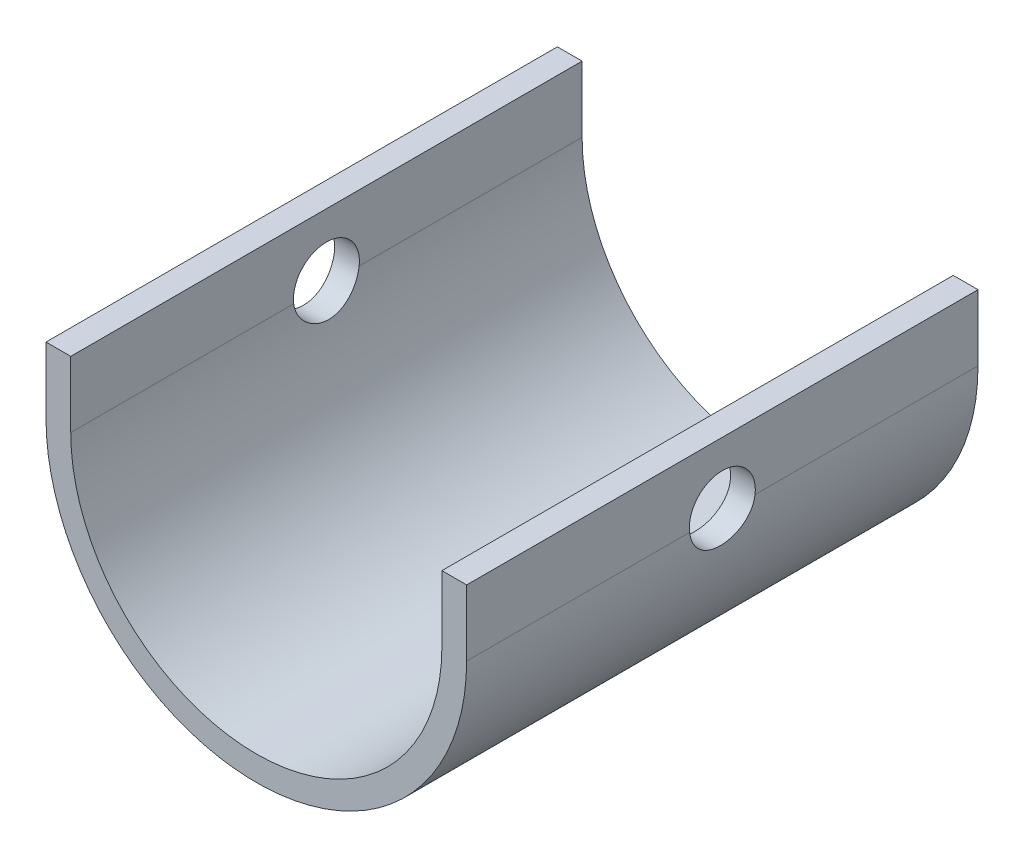
ISO-10303-21;
HEADER;
FILE_DESCRIPTION(('STEP AP214'),'2;1');
FILE_NAME('part.step','',(''),(''),'','','');
FILE_SCHEMA(('AUTOMOTIVE_DESIGN { 1 0 10303 214 1 1 1 1 }'));
ENDSEC;
DATA;
#1=APPLICATION_CONTEXT('core data for automotive mechanical design processes');
#2=APPLICATION_PROTOCOL_DEFINITION('international standard','automotive_design',2000,#1);
#3=PRODUCT_CONTEXT('',#1,'mechanical');
#4=PRODUCT('Part','Part','',(#3));
#5=PRODUCT_RELATED_PRODUCT_CATEGORY('part','',(#4));
#6=PRODUCT_DEFINITION_FORMATION('','',#4);
#7=PRODUCT_DEFINITION_CONTEXT('part definition',#1,'design');
#8=PRODUCT_DEFINITION('design','',#6,#7);
#9=PRODUCT_DEFINITION_SHAPE('','',#8);
#10=(LENGTH_UNIT() NAMED_UNIT(*) SI_UNIT(.MILLI.,.METRE.));
#11=(NAMED_UNIT(*) PLANE_ANGLE_UNIT() SI_UNIT($,.RADIAN.));
#12=(NAMED_UNIT(*) SI_UNIT($,.STERADIAN.) SOLID_ANGLE_UNIT());
#13=UNCERTAINTY_MEASURE_WITH_UNIT(LENGTH_MEASURE(1.E-05),#10,'distance_accuracy_value','');
#14=(GEOMETRIC_REPRESENTATION_CONTEXT(3) GLOBAL_UNCERTAINTY_ASSIGNED_CONTEXT((#13)) GLOBAL_UNIT_ASSIGNED_CONTEXT((#10,
#11,#12)) REPRESENTATION_CONTEXT('',''));
#15=CARTESIAN_POINT('',(0.,0.,0.));
#16=DIRECTION('',(0.,0.,1.));
#17=DIRECTION('',(1.,0.,0.));
#18=AXIS2_PLACEMENT_3D('',#15,#16,#17);
#19=CARTESIAN_POINT('',(0.,0.,-31.));
#20=DIRECTION('',(0.,0.,1.));
#21=DIRECTION('',(1.,0.,0.));
#22=AXIS2_PLACEMENT_3D('',#19,#20,#21);
#23=CYLINDRICAL_SURFACE('',#22,12.75);
#24=CARTESIAN_POINT('',(12.75,0.,-13.5156865167016));
#25=CARTESIAN_POINT('',(12.7500019823259,-0.0555459104248474,-13.5226846392623));
#26=CARTESIAN_POINT('',(12.7496366052787,-0.11077060603614,-13.5320131071527));
#27=CARTESIAN_POINT('',(12.7482150311856,-0.220230793773209,-13.5552593693715));
#28=CARTESIAN_POINT('',(12.7471589022158,-0.274466382837561,-13.5691767113832));
#29=CARTESIAN_POINT('',(12.7430256795552,-0.43496945274398,-13.6176424606988));
#30=CARTESIAN_POINT('',(12.738983398653,-0.539260279929183,-13.6589334558758));
#31=CARTESIAN_POINT('',(12.7289389113226,-0.739384796080866,-13.7582713081251));
#32=CARTESIAN_POINT('',(12.7229362431457,-0.835216485824841,-13.8163221124199));
#33=CARTESIAN_POINT('',(12.7097916366241,-1.01582448559224,-13.9475372306867));
#34=CARTESIAN_POINT('',(12.7026497302155,-1.10060110540118,-14.0207011210108));
#35=CARTESIAN_POINT('',(12.6881016648746,-1.25730985932378,-14.1806660809222));
#36=CARTESIAN_POINT('',(12.6806940250715,-1.3291495369595,-14.267557577447));
#37=CARTESIAN_POINT('',(12.6666109107127,-1.4572697596049,-14.45221256416));
#38=CARTESIAN_POINT('',(12.6599355277796,-1.51354835889452,-14.549977411785));
#39=CARTESIAN_POINT('',(12.6481578812441,-1.60901598087677,-14.7538422776427));
#40=CARTESIAN_POINT('',(12.6430586083877,-1.64817257137658,-14.8599576687502));
#41=CARTESIAN_POINT('',(12.6351057220364,-1.70807654235961,-15.0773369283919));
#42=CARTESIAN_POINT('',(12.6322518622685,-1.72882594174196,-15.1886002308949));
#43=CARTESIAN_POINT('',(12.6291696595492,-1.75120030356984,-15.4121606088703));
#44=CARTESIAN_POINT('',(12.6289203167666,-1.75297823265907,-15.524442098232));
#45=CARTESIAN_POINT('',(12.6310241032355,-1.73775348480014,-15.747698231883));
#46=CARTESIAN_POINT('',(12.6333772002391,-1.72075104056776,-15.8586728923485));
#47=CARTESIAN_POINT('',(12.6403727285631,-1.66857995697854,-16.0757277552502));
#48=CARTESIAN_POINT('',(12.6450062231918,-1.63348220630697,-16.1818253101163));
#49=CARTESIAN_POINT('',(12.6559767728514,-1.54618121223193,-16.38663799082));
#50=CARTESIAN_POINT('',(12.6623139107521,-1.49397713670304,-16.48535275724));
#51=CARTESIAN_POINT('',(12.6759470668604,-1.37351839633283,-16.6733446364352));
#52=CARTESIAN_POINT('',(12.6832494173857,-1.3051551554944,-16.7625517094753));
#53=CARTESIAN_POINT('',(12.6978511635886,-1.15446540349922,-16.9282931665022));
#54=CARTESIAN_POINT('',(12.7051505587428,-1.07213703245764,-17.0048258598205));
#55=CARTESIAN_POINT('',(12.7188420090206,-0.895247555729169,-17.1435092313658));
#56=CARTESIAN_POINT('',(12.7252281064842,-0.800613192864181,-17.2055670070589));
#57=CARTESIAN_POINT('',(12.7361574117312,-0.602186721294558,-17.3128633984538));
#58=CARTESIAN_POINT('',(12.7407020320764,-0.498401706576716,-17.3581149036922));
#59=CARTESIAN_POINT('',(12.7459393213529,-0.328013267084845,-17.4158338823871));
#60=CARTESIAN_POINT('',(12.7474465395899,-0.263358420275937,-17.4341578445234));
#61=CARTESIAN_POINT('',(12.7494787915869,-0.132619593209396,-17.4642037860857));
#62=CARTESIAN_POINT('',(12.7500052904795,-0.066537894236128,-17.4759355954279));
#63=CARTESIAN_POINT('',(12.75,0.,-17.4843134832984));
#64=B_SPLINE_CURVE_WITH_KNOTS('',3,(#24,#25,#26,#27,#28,#29,#30,#31,#32,#33,#34,#35,#36,#37,#38,
#39,#40,#41,#42,#43,#44,#45,#46,#47,#48,#49,#50,#51,#52,#53,#54,#55,#56,#57,#58,#59,#60,#61,#62,
#63),.UNSPECIFIED.,.F.,.F.,(4,2,2,2,2,2,2,2,2,2,2,2,2,2,2,2,2,2,2,4),(0.,0.167850371346322,
0.335684202939616,0.670674074812966,1.005742906997,1.34080234785317,1.67816875686227,
2.0155773303046,2.35362227715581,2.69163014268098,3.02691057723162,3.36218685722322,
3.69615955554619,4.03014850215376,4.36644877830833,4.70279387836108,5.0412416918435,
5.37942939476462,5.5807681315005,5.78180583894589),.UNSPECIFIED.);
#65=CARTESIAN_POINT('',(12.75,0.,-13.5156865167016));
#66=VERTEX_POINT('',#65);
#67=CARTESIAN_POINT('',(12.75,0.,-17.4843134832984));
#68=VERTEX_POINT('',#67);
#69=EDGE_CURVE('E60',#66,#68,#64,.T.);
#70=ORIENTED_EDGE('',*,*,#69,.F.);
#71=DIRECTION('',(0.,0.,1.));
#72=VECTOR('',#71,1.);
#73=CARTESIAN_POINT('',(12.75,0.,-31.));
#74=LINE('',#73,#72);
#75=CARTESIAN_POINT('',(12.75,0.,0.));
#76=VERTEX_POINT('',#75);
#77=EDGE_CURVE('E131',#76,#66,#74,.F.);
#78=ORIENTED_EDGE('',*,*,#77,.F.);
#79=CARTESIAN_POINT('',(0.,0.,0.));
#80=DIRECTION('',(0.,0.,1.));
#81=DIRECTION('',(1.,0.,0.));
#82=AXIS2_PLACEMENT_3D('',#79,#80,#81);
#83=CIRCLE('',#82,12.75);
#84=CARTESIAN_POINT('',(-12.75,0.,0.));
#85=VERTEX_POINT('',#84);
#86=EDGE_CURVE('E156',#85,#76,#83,.T.);
#87=ORIENTED_EDGE('',*,*,#86,.F.);
#88=DIRECTION('',(0.,0.,1.));
#89=VECTOR('',#88,1.);
#90=CARTESIAN_POINT('',(-12.75,0.,-31.));
#91=LINE('',#90,#89);
#92=CARTESIAN_POINT('',(-12.75,0.,-13.5156865167016));
#93=VERTEX_POINT('',#92);
#94=EDGE_CURVE('E212',#93,#85,#91,.T.);
#95=ORIENTED_EDGE('',*,*,#94,.F.);
#96=CARTESIAN_POINT('',(-12.75,0.,-17.4843134832984));
#97=CARTESIAN_POINT('',(-12.7500019823259,-0.055545910424845,-17.4773153607377));
#98=CARTESIAN_POINT('',(-12.7496366052787,-0.110770606036137,-17.4679868928473));
#99=CARTESIAN_POINT('',(-12.7482150311856,-0.220230793773207,-17.4447406306285));
#100=CARTESIAN_POINT('',(-12.7471589022158,-0.274466382837559,-17.4308232886168));
#101=CARTESIAN_POINT('',(-12.7430256795552,-0.434969452743978,-17.3823575393012));
#102=CARTESIAN_POINT('',(-12.738983398653,-0.53926027992918,-17.3410665441242));
#103=CARTESIAN_POINT('',(-12.7289389113226,-0.739384796080864,-17.2417286918749));
#104=CARTESIAN_POINT('',(-12.7229362431457,-0.83521648582484,-17.1836778875801));
#105=CARTESIAN_POINT('',(-12.7097916366241,-1.01582448559224,-17.0524627693133));
#106=CARTESIAN_POINT('',(-12.7026497302155,-1.10060110540118,-16.9792988789892));
#107=CARTESIAN_POINT('',(-12.6881016648746,-1.25730985932377,-16.8193339190778));
#108=CARTESIAN_POINT('',(-12.6806940250715,-1.3291495369595,-16.732442422553));
#109=CARTESIAN_POINT('',(-12.6666109107127,-1.4572697596049,-16.54778743584));
#110=CARTESIAN_POINT('',(-12.6599355277796,-1.51354835889452,-16.450022588215));
#111=CARTESIAN_POINT('',(-12.6481578812441,-1.60901598087677,-16.2461577223573));
#112=CARTESIAN_POINT('',(-12.6430586083877,-1.64817257137658,-16.1400423312498));
#113=CARTESIAN_POINT('',(-12.6351057220364,-1.70807654235961,-15.9226630716081));
#114=CARTESIAN_POINT('',(-12.6322518622685,-1.72882594174195,-15.8113997691051));
#115=CARTESIAN_POINT('',(-12.6291696595492,-1.75120030356984,-15.5878393911297));
#116=CARTESIAN_POINT('',(-12.6289203167666,-1.75297823265906,-15.475557901768));
#117=CARTESIAN_POINT('',(-12.6310241032355,-1.73775348480014,-15.252301768117));
#118=CARTESIAN_POINT('',(-12.6333772002391,-1.72075104056776,-15.1413271076515));
#119=CARTESIAN_POINT('',(-12.6403727285631,-1.66857995697853,-14.9242722447498));
#120=CARTESIAN_POINT('',(-12.6450062231918,-1.63348220630697,-14.8181746898837));
#121=CARTESIAN_POINT('',(-12.6559767728514,-1.54618121223193,-14.61336200918));
#122=CARTESIAN_POINT('',(-12.6623139107521,-1.49397713670304,-14.51464724276));
#123=CARTESIAN_POINT('',(-12.6759470668604,-1.37351839633283,-14.3266553635648));
#124=CARTESIAN_POINT('',(-12.6832494173857,-1.3051551554944,-14.2374482905247));
#125=CARTESIAN_POINT('',(-12.6978511635886,-1.15446540349922,-14.0717068334978));
#126=CARTESIAN_POINT('',(-12.7051505587428,-1.07213703245764,-13.9951741401795));
#127=CARTESIAN_POINT('',(-12.7188420090206,-0.895247555729169,-13.8564907686342));
#128=CARTESIAN_POINT('',(-12.7252281064842,-0.80061319286418,-13.7944329929411));
#129=CARTESIAN_POINT('',(-12.7361574117312,-0.602186721294558,-13.6871366015463));
#130=CARTESIAN_POINT('',(-12.7407020320764,-0.498401706576718,-13.6418850963078));
#131=CARTESIAN_POINT('',(-12.7459393213529,-0.328013267084847,-13.5841661176129));
#132=CARTESIAN_POINT('',(-12.7474465395899,-0.263358420275937,-13.5658421554766));
#133=CARTESIAN_POINT('',(-12.7494787915869,-0.132619593209395,-13.5357962139143));
#134=CARTESIAN_POINT('',(-12.7500052904795,-0.0665378942361259,-13.5240644045721));
#135=CARTESIAN_POINT('',(-12.75,0.,-13.5156865167016));
#136=B_SPLINE_CURVE_WITH_KNOTS('',3,(#96,#97,#98,#99,#100,#101,#102,#103,#104,#105,#106,#107,
#108,#109,#110,#111,#112,#113,#114,#115,#116,#117,#118,#119,#120,#121,#122,#123,#124,#125,#126,
#127,#128,#129,#130,#131,#132,#133,#134,#135),.UNSPECIFIED.,.F.,.F.,(4,2,2,2,2,2,2,2,2,2,2,2,2,
2,2,2,2,2,2,4),(0.,0.167850371346322,0.335684202939615,0.670674074812964,1.005742906997,
1.34080234785317,1.67816875686226,2.0155773303046,2.35362227715581,2.69163014268098,
3.02691057723161,3.36218685722322,3.69615955554618,4.03014850215376,4.36644877830833,
4.70279387836108,5.0412416918435,5.37942939476461,5.58076813150049,5.78180583894589),.UNSPECIFIED.);
#137=CARTESIAN_POINT('',(-12.75,0.,-17.4843134832984));
#138=VERTEX_POINT('',#137);
#139=EDGE_CURVE('E225',#138,#93,#136,.T.);
#140=ORIENTED_EDGE('',*,*,#139,.F.);
#141=CARTESIAN_POINT('',(-12.75,0.,-31.));
#142=VERTEX_POINT('',#141);
#143=EDGE_CURVE('E150',#142,#138,#91,.T.);
#144=ORIENTED_EDGE('',*,*,#143,.F.);
#145=CARTESIAN_POINT('',(0.,0.,-31.));
#146=DIRECTION('',(0.,0.,1.));
#147=DIRECTION('',(1.,0.,0.));
#148=AXIS2_PLACEMENT_3D('',#145,#146,#147);
#149=CIRCLE('',#148,12.75);
#150=CARTESIAN_POINT('',(12.75,0.,-31.));
#151=VERTEX_POINT('',#150);
#152=EDGE_CURVE('E158',#142,#151,#149,.T.);
#153=ORIENTED_EDGE('',*,*,#152,.T.);
#154=EDGE_CURVE('E134',#68,#151,#74,.F.);
#155=ORIENTED_EDGE('',*,*,#154,.F.);
#156=EDGE_LOOP('',(#70,#78,#87,#95,#140,#144,#153,#155));
#157=FACE_BOUND('',#156,.T.);
#158=ADVANCED_FACE('F38',(#157),#23,.T.);
#159=CARTESIAN_POINT('',(0.,0.,-31.));
#160=DIRECTION('',(0.,0.,1.));
#161=DIRECTION('',(1.,0.,0.));
#162=AXIS2_PLACEMENT_3D('',#159,#160,#161);
#163=PLANE('',#162);
#164=ORIENTED_EDGE('',*,*,#152,.F.);
#165=DIRECTION('',(0.,-1.,0.));
#166=VECTOR('',#165,1.);
#167=CARTESIAN_POINT('',(-12.75,4.,-31.));
#168=LINE('',#167,#166);
#169=CARTESIAN_POINT('',(-12.75,4.,-31.));
#170=VERTEX_POINT('',#169);
#171=EDGE_CURVE('E202',#170,#142,#168,.T.);
#172=ORIENTED_EDGE('',*,*,#171,.F.);
#173=DIRECTION('',(-1.,0.,0.));
#174=VECTOR('',#173,1.);
#175=CARTESIAN_POINT('',(-12.75,4.,-31.));
#176=LINE('',#175,#174);
#177=CARTESIAN_POINT('',(-11.25,4.,-31.));
#178=VERTEX_POINT('',#177);
#179=EDGE_CURVE('E198',#178,#170,#176,.T.);
#180=ORIENTED_EDGE('',*,*,#179,.F.);
#181=DIRECTION('',(0.,-1.,0.));
#182=VECTOR('',#181,1.);
#183=CARTESIAN_POINT('',(-11.25,4.,-31.));
#184=LINE('',#183,#182);
#185=CARTESIAN_POINT('',(-11.25,0.,-31.));
#186=VERTEX_POINT('',#185);
#187=EDGE_CURVE('E196',#178,#186,#184,.T.);
#188=ORIENTED_EDGE('',*,*,#187,.T.);
#189=CARTESIAN_POINT('',(0.,0.,-31.));
#190=DIRECTION('',(0.,0.,1.));
#191=DIRECTION('',(1.,0.,0.));
#192=AXIS2_PLACEMENT_3D('',#189,#190,#191);
#193=CIRCLE('',#192,11.25);
#194=CARTESIAN_POINT('',(11.25,0.,-31.));
#195=VERTEX_POINT('',#194);
#196=EDGE_CURVE('E148',#186,#195,#193,.T.);
#197=ORIENTED_EDGE('',*,*,#196,.T.);
#198=DIRECTION('',(0.,-1.,0.));
#199=VECTOR('',#198,1.);
#200=CARTESIAN_POINT('',(11.25,4.,-31.));
#201=LINE('',#200,#199);
#202=CARTESIAN_POINT('',(11.25,4.,-31.));
#203=VERTEX_POINT('',#202);
#204=EDGE_CURVE('E193',#203,#195,#201,.T.);
#205=ORIENTED_EDGE('',*,*,#204,.F.);
#206=DIRECTION('',(-1.,0.,0.));
#207=VECTOR('',#206,1.);
#208=CARTESIAN_POINT('',(11.25,4.,-31.));
#209=LINE('',#208,#207);
#210=CARTESIAN_POINT('',(12.75,4.,-31.));
#211=VERTEX_POINT('',#210);
#212=EDGE_CURVE('E229',#211,#203,#209,.T.);
#213=ORIENTED_EDGE('',*,*,#212,.F.);
#214=DIRECTION('',(0.,-1.,0.));
#215=VECTOR('',#214,1.);
#216=CARTESIAN_POINT('',(12.75,4.,-31.));
#217=LINE('',#216,#215);
#218=EDGE_CURVE('E228',#211,#151,#217,.T.);
#219=ORIENTED_EDGE('',*,*,#218,.T.);
#220=EDGE_LOOP('',(#164,#172,#180,#188,#197,#205,#213,#219));
#221=FACE_BOUND('',#220,.T.);
#222=ADVANCED_FACE('F191',(#221),#163,.F.);
#223=CARTESIAN_POINT('',(0.,0.,0.));
#224=DIRECTION('',(0.,0.,1.));
#225=DIRECTION('',(1.,0.,0.));
#226=AXIS2_PLACEMENT_3D('',#223,#224,#225);
#227=PLANE('',#226);
#228=CARTESIAN_POINT('',(0.,0.,0.));
#229=DIRECTION('',(0.,0.,1.));
#230=DIRECTION('',(1.,0.,0.));
#231=AXIS2_PLACEMENT_3D('',#228,#229,#230);
#232=CIRCLE('',#231,11.25);
#233=CARTESIAN_POINT('',(-11.25,0.,0.));
#234=VERTEX_POINT('',#233);
#235=CARTESIAN_POINT('',(11.25,0.,0.));
#236=VERTEX_POINT('',#235);
#237=EDGE_CURVE('E143',#234,#236,#232,.T.);
#238=ORIENTED_EDGE('',*,*,#237,.F.);
#239=DIRECTION('',(0.,-1.,0.));
#240=VECTOR('',#239,1.);
#241=CARTESIAN_POINT('',(-11.25,4.,0.));
#242=LINE('',#241,#240);
#243=CARTESIAN_POINT('',(-11.25,4.,0.));
#244=VERTEX_POINT('',#243);
#245=EDGE_CURVE('E201',#244,#234,#242,.T.);
#246=ORIENTED_EDGE('',*,*,#245,.F.);
#247=DIRECTION('',(1.,0.,0.));
#248=VECTOR('',#247,1.);
#249=CARTESIAN_POINT('',(-12.75,4.,0.));
#250=LINE('',#249,#248);
#251=CARTESIAN_POINT('',(-12.75,4.,0.));
#252=VERTEX_POINT('',#251);
#253=EDGE_CURVE('E245',#252,#244,#250,.T.);
#254=ORIENTED_EDGE('',*,*,#253,.F.);
#255=DIRECTION('',(0.,-1.,0.));
#256=VECTOR('',#255,1.);
#257=CARTESIAN_POINT('',(-12.75,4.,0.));
#258=LINE('',#257,#256);
#259=EDGE_CURVE('E206',#252,#85,#258,.T.);
#260=ORIENTED_EDGE('',*,*,#259,.T.);
#261=ORIENTED_EDGE('',*,*,#86,.T.);
#262=DIRECTION('',(0.,-1.,0.));
#263=VECTOR('',#262,1.);
#264=CARTESIAN_POINT('',(12.75,4.,0.));
#265=LINE('',#264,#263);
#266=CARTESIAN_POINT('',(12.75,4.,0.));
#267=VERTEX_POINT('',#266);
#268=EDGE_CURVE('E141',#267,#76,#265,.T.);
#269=ORIENTED_EDGE('',*,*,#268,.F.);
#270=DIRECTION('',(1.,0.,0.));
#271=VECTOR('',#270,1.);
#272=CARTESIAN_POINT('',(11.25,4.,0.));
#273=LINE('',#272,#271);
#274=CARTESIAN_POINT('',(11.25,4.,0.));
#275=VERTEX_POINT('',#274);
#276=EDGE_CURVE('E309',#275,#267,#273,.T.);
#277=ORIENTED_EDGE('',*,*,#276,.F.);
#278=DIRECTION('',(0.,-1.,0.));
#279=VECTOR('',#278,1.);
#280=CARTESIAN_POINT('',(11.25,4.,0.));
#281=LINE('',#280,#279);
#282=EDGE_CURVE('E234',#275,#236,#281,.T.);
#283=ORIENTED_EDGE('',*,*,#282,.T.);
#284=EDGE_LOOP('',(#238,#246,#254,#260,#261,#269,#277,#283));
#285=FACE_BOUND('',#284,.T.);
#286=ADVANCED_FACE('F255',(#285),#227,.T.);
#287=CARTESIAN_POINT('',(0.,0.,-31.));
#288=DIRECTION('',(0.,0.,1.));
#289=DIRECTION('',(1.,0.,0.));
#290=AXIS2_PLACEMENT_3D('',#287,#288,#289);
#291=CYLINDRICAL_SURFACE('',#290,11.25);
#292=DIRECTION('',(0.,0.,1.));
#293=VECTOR('',#292,1.);
#294=CARTESIAN_POINT('',(11.25,0.,-31.));
#295=LINE('',#294,#293);
#296=CARTESIAN_POINT('',(11.25,0.,-13.5156865167016));
#297=VERTEX_POINT('',#296);
#298=EDGE_CURVE('E169',#236,#297,#295,.F.);
#299=ORIENTED_EDGE('',*,*,#298,.T.);
#300=CARTESIAN_POINT('',(11.25,0.,-13.5156865167016));
#301=CARTESIAN_POINT('',(11.2500022359805,-0.0554666503033602,-13.522674548127));
#302=CARTESIAN_POINT('',(11.2495893298413,-0.110612776390918,-13.531986459129));
#303=CARTESIAN_POINT('',(11.2479827762684,-0.219916091390132,-13.5551856888969));
#304=CARTESIAN_POINT('',(11.2467892167346,-0.274073390935891,-13.5690724924525));
#305=CARTESIAN_POINT('',(11.2421183715817,-0.434330384839295,-13.6174209198597));
#306=CARTESIAN_POINT('',(11.237550499328,-0.538455110749772,-13.6586010732276));
#307=CARTESIAN_POINT('',(11.2261982032393,-0.738257167129289,-13.7576448212889));
#308=CARTESIAN_POINT('',(11.2194133968992,-0.833933036229499,-13.8155112948016));
#309=CARTESIAN_POINT('',(11.2045496574264,-1.01427718445231,-13.9462934116083));
#310=CARTESIAN_POINT('',(11.1964707006402,-1.09894526233269,-14.0192093299701));
#311=CARTESIAN_POINT('',(11.179986635582,-1.25565828144758,-14.1787843164869));
#312=CARTESIAN_POINT('',(11.1715792822598,-1.32758554006715,-14.265558715109));
#313=CARTESIAN_POINT('',(11.155582456209,-1.45591023104174,-14.4500036033069));
#314=CARTESIAN_POINT('',(11.1479930810042,-1.51230581286896,-14.5476753893101));
#315=CARTESIAN_POINT('',(11.1345853849051,-1.60806227272614,-14.751461594866));
#316=CARTESIAN_POINT('',(11.1287715597275,-1.64738001387997,-14.8575966013241));
#317=CARTESIAN_POINT('',(11.119693013404,-1.70759005595971,-15.0750675746331));
#318=CARTESIAN_POINT('',(11.1164279727298,-1.7284846665444,-15.1864028876922));
#319=CARTESIAN_POINT('',(11.1128895779355,-1.75109019277927,-15.4098827382337));
#320=CARTESIAN_POINT('',(11.1125855602326,-1.7529977380863,-15.5220069211021));
#321=CARTESIAN_POINT('',(11.1149279464192,-1.73808280227498,-15.7449689586512));
#322=CARTESIAN_POINT('',(11.1175742933856,-1.72126068251955,-15.8558068381077));
#323=CARTESIAN_POINT('',(11.1254585993827,-1.66953389039202,-16.0724807757364));
#324=CARTESIAN_POINT('',(11.1306833652268,-1.63472122921325,-16.1783393228684));
#325=CARTESIAN_POINT('',(11.1430622075821,-1.54808542189428,-16.3827292761232));
#326=CARTESIAN_POINT('',(11.1502164052166,-1.49626120778205,-16.4812602217485));
#327=CARTESIAN_POINT('',(11.1656317074409,-1.37652891326266,-16.6691555017366));
#328=CARTESIAN_POINT('',(11.173902086926,-1.30848194455054,-16.7584305588906));
#329=CARTESIAN_POINT('',(11.1904527275512,-1.15842578127252,-16.9243774003769));
#330=CARTESIAN_POINT('',(11.1987329899345,-1.07641459308187,-17.0010473820485));
#331=CARTESIAN_POINT('',(11.2142962186482,-0.899976578222473,-17.140208361135));
#332=CARTESIAN_POINT('',(11.2215706562653,-0.80545547464605,-17.2025807415254));
#333=CARTESIAN_POINT('',(11.2340407757147,-0.607171625621715,-17.3105172656209));
#334=CARTESIAN_POINT('',(11.2392380717176,-0.503416133294597,-17.3560944589027));
#335=CARTESIAN_POINT('',(11.2452778218169,-0.332246190539968,-17.4145824510407));
#336=CARTESIAN_POINT('',(11.2470301266697,-0.266781507231369,-17.4332765585897));
#337=CARTESIAN_POINT('',(11.2493936038471,-0.13436592865247,-17.463893350407));
#338=CARTESIAN_POINT('',(11.2500063960408,-0.0674172802136455,-17.4758256301082));
#339=CARTESIAN_POINT('',(11.25,0.,-17.4843134832984));
#340=B_SPLINE_CURVE_WITH_KNOTS('',3,(#300,#301,#302,#303,#304,#305,#306,#307,#308,#309,#310,
#311,#312,#313,#314,#315,#316,#317,#318,#319,#320,#321,#322,#323,#324,#325,#326,#327,#328,#329,
#330,#331,#332,#333,#334,#335,#336,#337,#338,#339),.UNSPECIFIED.,.F.,.F.,(4,2,2,2,2,2,2,2,2,2,2,
2,2,2,2,2,2,2,2,4),(0.,0.167610397924528,0.335201926529131,0.66966872517924,1.00419326251436,
1.3387239147,1.67619943964448,2.01371515586659,2.35207851347793,2.69039944534299,
3.0252130413986,3.360020177802,3.69313167186403,4.02626408240693,4.36235800734443,
4.6984999555771,5.03733711054785,5.37591043687534,5.57989121804289,5.78358180889217),.UNSPECIFIED.);
#341=CARTESIAN_POINT('',(11.25,0.,-17.4843134832984));
#342=VERTEX_POINT('',#341);
#343=EDGE_CURVE('E53',#297,#342,#340,.T.);
#344=ORIENTED_EDGE('',*,*,#343,.T.);
#345=EDGE_CURVE('E168',#342,#195,#295,.F.);
#346=ORIENTED_EDGE('',*,*,#345,.T.);
#347=ORIENTED_EDGE('',*,*,#196,.F.);
#348=DIRECTION('',(0.,0.,1.));
#349=VECTOR('',#348,1.);
#350=CARTESIAN_POINT('',(-11.25,0.,-31.));
#351=LINE('',#350,#349);
#352=CARTESIAN_POINT('',(-11.25,0.,-17.4843134832984));
#353=VERTEX_POINT('',#352);
#354=EDGE_CURVE('E164',#186,#353,#351,.T.);
#355=ORIENTED_EDGE('',*,*,#354,.T.);
#356=CARTESIAN_POINT('',(-11.25,0.,-17.4843134832984));
#357=CARTESIAN_POINT('',(-11.2500022359805,-0.0554666503033593,-17.477325451873));
#358=CARTESIAN_POINT('',(-11.2495893298413,-0.110612776390917,-17.468013540871));
#359=CARTESIAN_POINT('',(-11.2479827762684,-0.219916091390131,-17.4448143111031));
#360=CARTESIAN_POINT('',(-11.2467892167346,-0.27407339093589,-17.4309275075475));
#361=CARTESIAN_POINT('',(-11.2421183715817,-0.434330384839294,-17.3825790801403));
#362=CARTESIAN_POINT('',(-11.237550499328,-0.53845511074977,-17.3413989267724));
#363=CARTESIAN_POINT('',(-11.2261982032393,-0.73825716712929,-17.2423551787111));
#364=CARTESIAN_POINT('',(-11.2194133968992,-0.833933036229501,-17.1844887051983));
#365=CARTESIAN_POINT('',(-11.2045496574264,-1.01427718445231,-17.0537065883917));
#366=CARTESIAN_POINT('',(-11.1964707006402,-1.09894526233269,-16.9807906700299));
#367=CARTESIAN_POINT('',(-11.179986635582,-1.25565828144758,-16.8212156835131));
#368=CARTESIAN_POINT('',(-11.1715792822598,-1.32758554006715,-16.734441284891));
#369=CARTESIAN_POINT('',(-11.155582456209,-1.45591023104174,-16.5499963966931));
#370=CARTESIAN_POINT('',(-11.1479930810042,-1.51230581286896,-16.4523246106899));
#371=CARTESIAN_POINT('',(-11.1345853849051,-1.60806227272614,-16.248538405134));
#372=CARTESIAN_POINT('',(-11.1287715597275,-1.64738001387997,-16.1424033986759));
#373=CARTESIAN_POINT('',(-11.119693013404,-1.70759005595971,-15.9249324253669));
#374=CARTESIAN_POINT('',(-11.1164279727298,-1.7284846665444,-15.8135971123078));
#375=CARTESIAN_POINT('',(-11.1128895779355,-1.75109019277927,-15.5901172617663));
#376=CARTESIAN_POINT('',(-11.1125855602326,-1.7529977380863,-15.4779930788979));
#377=CARTESIAN_POINT('',(-11.1149279464192,-1.73808280227497,-15.2550310413488));
#378=CARTESIAN_POINT('',(-11.1175742933856,-1.72126068251955,-15.1441931618923));
#379=CARTESIAN_POINT('',(-11.1254585993827,-1.66953389039202,-14.9275192242636));
#380=CARTESIAN_POINT('',(-11.1306833652268,-1.63472122921324,-14.8216606771316));
#381=CARTESIAN_POINT('',(-11.1430622075821,-1.54808542189428,-14.6172707238768));
#382=CARTESIAN_POINT('',(-11.1502164052166,-1.49626120778205,-14.5187397782515));
#383=CARTESIAN_POINT('',(-11.1656317074409,-1.37652891326266,-14.3308444982634));
#384=CARTESIAN_POINT('',(-11.173902086926,-1.30848194455054,-14.2415694411094));
#385=CARTESIAN_POINT('',(-11.1904527275512,-1.15842578127251,-14.0756225996231));
#386=CARTESIAN_POINT('',(-11.1987329899345,-1.07641459308187,-13.9989526179515));
#387=CARTESIAN_POINT('',(-11.2142962186482,-0.89997657822247,-13.8597916388649));
#388=CARTESIAN_POINT('',(-11.2215706562653,-0.805455474646048,-13.7974192584746));
#389=CARTESIAN_POINT('',(-11.2340407757147,-0.607171625621714,-13.6894827343791));
#390=CARTESIAN_POINT('',(-11.2392380717176,-0.503416133294596,-13.6439055410973));
#391=CARTESIAN_POINT('',(-11.2452778218169,-0.332246190539967,-13.5854175489593));
#392=CARTESIAN_POINT('',(-11.2470301266697,-0.266781507231369,-13.5667234414103));
#393=CARTESIAN_POINT('',(-11.2493936038471,-0.134365928652469,-13.536106649593));
#394=CARTESIAN_POINT('',(-11.2500063960408,-0.067417280213644,-13.5241743698918));
#395=CARTESIAN_POINT('',(-11.25,0.,-13.5156865167016));
#396=B_SPLINE_CURVE_WITH_KNOTS('',3,(#356,#357,#358,#359,#360,#361,#362,#363,#364,#365,#366,
#367,#368,#369,#370,#371,#372,#373,#374,#375,#376,#377,#378,#379,#380,#381,#382,#383,#384,#385,
#386,#387,#388,#389,#390,#391,#392,#393,#394,#395),.UNSPECIFIED.,.F.,.F.,(4,2,2,2,2,2,2,2,2,2,2,
2,2,2,2,2,2,2,2,4),(0.,0.167610397924528,0.335201926529131,0.669668725179241,1.00419326251437,
1.3387239147,1.67619943964448,2.01371515586659,2.35207851347793,2.69039944534299,
3.0252130413986,3.360020177802,3.69313167186403,4.02626408240693,4.36235800734443,
4.6984999555771,5.03733711054784,5.37591043687534,5.57989121804288,5.78358180889217),.UNSPECIFIED.);
#397=CARTESIAN_POINT('',(-11.25,0.,-13.5156865167016));
#398=VERTEX_POINT('',#397);
#399=EDGE_CURVE('E185',#353,#398,#396,.T.);
#400=ORIENTED_EDGE('',*,*,#399,.T.);
#401=EDGE_CURVE('E161',#398,#234,#351,.T.);
#402=ORIENTED_EDGE('',*,*,#401,.T.);
#403=ORIENTED_EDGE('',*,*,#237,.T.);
#404=EDGE_LOOP('',(#299,#344,#346,#347,#355,#400,#402,#403));
#405=FACE_BOUND('',#404,.T.);
#406=ADVANCED_FACE('F184',(#405),#291,.F.);
#407=CARTESIAN_POINT('',(-12.75,4.,-31.));
#408=DIRECTION('',(1.,0.,0.));
#409=DIRECTION('',(0.,0.,-1.));
#410=AXIS2_PLACEMENT_3D('',#407,#408,#409);
#411=PLANE('',#410);
#412=ORIENTED_EDGE('',*,*,#143,.T.);
#413=CARTESIAN_POINT('',(-12.75,0.25,-15.5));
#414=DIRECTION('',(-1.,0.,0.));
#415=DIRECTION('',(0.,0.,1.));
#416=AXIS2_PLACEMENT_3D('',#413,#414,#415);
#417=CIRCLE('',#416,2.);
#418=EDGE_CURVE('E136',#93,#138,#417,.T.);
#419=ORIENTED_EDGE('',*,*,#418,.F.);
#420=ORIENTED_EDGE('',*,*,#94,.T.);
#421=ORIENTED_EDGE('',*,*,#259,.F.);
#422=DIRECTION('',(0.,0.,1.));
#423=VECTOR('',#422,1.);
#424=CARTESIAN_POINT('',(-12.75,4.,-31.));
#425=LINE('',#424,#423);
#426=EDGE_CURVE('E241',#170,#252,#425,.T.);
#427=ORIENTED_EDGE('',*,*,#426,.F.);
#428=ORIENTED_EDGE('',*,*,#171,.T.);
#429=EDGE_LOOP('',(#412,#419,#420,#421,#427,#428));
#430=FACE_BOUND('',#429,.T.);
#431=ADVANCED_FACE('F222',(#430),#411,.F.);
#432=CARTESIAN_POINT('',(-11.25,4.,-31.));
#433=DIRECTION('',(-1.,0.,0.));
#434=DIRECTION('',(0.,0.,1.));
#435=AXIS2_PLACEMENT_3D('',#432,#433,#434);
#436=PLANE('',#435);
#437=ORIENTED_EDGE('',*,*,#401,.F.);
#438=CARTESIAN_POINT('',(-11.25,0.25,-15.5));
#439=DIRECTION('',(-1.,0.,0.));
#440=DIRECTION('',(0.,0.,1.));
#441=AXIS2_PLACEMENT_3D('',#438,#439,#440);
#442=CIRCLE('',#441,2.);
#443=EDGE_CURVE('E47',#398,#353,#442,.T.);
#444=ORIENTED_EDGE('',*,*,#443,.T.);
#445=ORIENTED_EDGE('',*,*,#354,.F.);
#446=ORIENTED_EDGE('',*,*,#187,.F.);
#447=DIRECTION('',(0.,0.,-1.));
#448=VECTOR('',#447,1.);
#449=CARTESIAN_POINT('',(-11.25,4.,-31.));
#450=LINE('',#449,#448);
#451=EDGE_CURVE('E248',#244,#178,#450,.T.);
#452=ORIENTED_EDGE('',*,*,#451,.F.);
#453=ORIENTED_EDGE('',*,*,#245,.T.);
#454=EDGE_LOOP('',(#437,#444,#445,#446,#452,#453));
#455=FACE_BOUND('',#454,.T.);
#456=ADVANCED_FACE('F177',(#455),#436,.F.);
#457=CARTESIAN_POINT('',(0.,4.,0.));
#458=DIRECTION('',(0.,1.,0.));
#459=DIRECTION('',(0.,0.,1.));
#460=AXIS2_PLACEMENT_3D('',#457,#458,#459);
#461=PLANE('',#460);
#462=ORIENTED_EDGE('',*,*,#426,.T.);
#463=ORIENTED_EDGE('',*,*,#253,.T.);
#464=ORIENTED_EDGE('',*,*,#451,.T.);
#465=ORIENTED_EDGE('',*,*,#179,.T.);
#466=EDGE_LOOP('',(#462,#463,#464,#465));
#467=FACE_BOUND('',#466,.T.);
#468=ADVANCED_FACE('F252',(#467),#461,.T.);
#469=CARTESIAN_POINT('',(11.25,4.,-31.));
#470=DIRECTION('',(1.,0.,0.));
#471=DIRECTION('',(0.,0.,-1.));
#472=AXIS2_PLACEMENT_3D('',#469,#470,#471);
#473=PLANE('',#472);
#474=ORIENTED_EDGE('',*,*,#345,.F.);
#475=CARTESIAN_POINT('',(11.25,0.25,-15.5));
#476=DIRECTION('',(1.,0.,0.));
#477=DIRECTION('',(0.,0.,-1.));
#478=AXIS2_PLACEMENT_3D('',#475,#476,#477);
#479=CIRCLE('',#478,2.);
#480=EDGE_CURVE('E262',#342,#297,#479,.T.);
#481=ORIENTED_EDGE('',*,*,#480,.T.);
#482=ORIENTED_EDGE('',*,*,#298,.F.);
#483=ORIENTED_EDGE('',*,*,#282,.F.);
#484=DIRECTION('',(0.,0.,1.));
#485=VECTOR('',#484,1.);
#486=CARTESIAN_POINT('',(11.25,4.,-31.));
#487=LINE('',#486,#485);
#488=EDGE_CURVE('E305',#203,#275,#487,.T.);
#489=ORIENTED_EDGE('',*,*,#488,.F.);
#490=ORIENTED_EDGE('',*,*,#204,.T.);
#491=EDGE_LOOP('',(#474,#481,#482,#483,#489,#490));
#492=FACE_BOUND('',#491,.T.);
#493=ADVANCED_FACE('F261',(#492),#473,.F.);
#494=CARTESIAN_POINT('',(12.75,4.,-31.));
#495=DIRECTION('',(-1.,0.,0.));
#496=DIRECTION('',(0.,0.,1.));
#497=AXIS2_PLACEMENT_3D('',#494,#495,#496);
#498=PLANE('',#497);
#499=ORIENTED_EDGE('',*,*,#77,.T.);
#500=CARTESIAN_POINT('',(12.75,0.25,-15.5));
#501=DIRECTION('',(-1.,0.,0.));
#502=DIRECTION('',(0.,0.,1.));
#503=AXIS2_PLACEMENT_3D('',#500,#501,#502);
#504=CIRCLE('',#503,2.);
#505=EDGE_CURVE('E11',#66,#68,#504,.T.);
#506=ORIENTED_EDGE('',*,*,#505,.T.);
#507=ORIENTED_EDGE('',*,*,#154,.T.);
#508=ORIENTED_EDGE('',*,*,#218,.F.);
#509=DIRECTION('',(0.,0.,-1.));
#510=VECTOR('',#509,1.);
#511=CARTESIAN_POINT('',(12.75,4.,-31.));
#512=LINE('',#511,#510);
#513=EDGE_CURVE('E312',#267,#211,#512,.T.);
#514=ORIENTED_EDGE('',*,*,#513,.F.);
#515=ORIENTED_EDGE('',*,*,#268,.T.);
#516=EDGE_LOOP('',(#499,#506,#507,#508,#514,#515));
#517=FACE_BOUND('',#516,.T.);
#518=ADVANCED_FACE('F138',(#517),#498,.F.);
#519=CARTESIAN_POINT('',(0.,4.,0.));
#520=DIRECTION('',(0.,1.,0.));
#521=DIRECTION('',(0.,0.,1.));
#522=AXIS2_PLACEMENT_3D('',#519,#520,#521);
#523=PLANE('',#522);
#524=ORIENTED_EDGE('',*,*,#488,.T.);
#525=ORIENTED_EDGE('',*,*,#276,.T.);
#526=ORIENTED_EDGE('',*,*,#513,.T.);
#527=ORIENTED_EDGE('',*,*,#212,.T.);
#528=EDGE_LOOP('',(#524,#525,#526,#527));
#529=FACE_BOUND('',#528,.T.);
#530=ADVANCED_FACE('F289',(#529),#523,.T.);
#531=CARTESIAN_POINT('',(-10.75,0.25,-15.5));
#532=DIRECTION('',(-1.,0.,0.));
#533=DIRECTION('',(0.,0.,1.));
#534=AXIS2_PLACEMENT_3D('',#531,#532,#533);
#535=CYLINDRICAL_SURFACE('',#534,2.);
#536=ORIENTED_EDGE('',*,*,#139,.T.);
#537=ORIENTED_EDGE('',*,*,#418,.T.);
#538=EDGE_LOOP('',(#536,#537));
#539=FACE_BOUND('',#538,.T.);
#540=ORIENTED_EDGE('',*,*,#443,.F.);
#541=ORIENTED_EDGE('',*,*,#399,.F.);
#542=EDGE_LOOP('',(#540,#541));
#543=FACE_BOUND('',#542,.T.);
#544=ADVANCED_FACE('F284',(#539,#543),#535,.F.);
#545=CARTESIAN_POINT('',(10.75,0.25,-15.5));
#546=DIRECTION('',(1.,0.,0.));
#547=DIRECTION('',(0.,0.,-1.));
#548=AXIS2_PLACEMENT_3D('',#545,#546,#547);
#549=CYLINDRICAL_SURFACE('',#548,2.);
#550=ORIENTED_EDGE('',*,*,#69,.T.);
#551=ORIENTED_EDGE('',*,*,#505,.F.);
#552=EDGE_LOOP('',(#550,#551));
#553=FACE_BOUND('',#552,.T.);
#554=ORIENTED_EDGE('',*,*,#480,.F.);
#555=ORIENTED_EDGE('',*,*,#343,.F.);
#556=EDGE_LOOP('',(#554,#555));
#557=FACE_BOUND('',#556,.T.);
#558=ADVANCED_FACE('F124',(#553,#557),#549,.F.);
#559=CLOSED_SHELL('',(#158,#222,#286,#406,#431,#456,#468,#493,#518,#530,#544,#558));
#560=MANIFOLD_SOLID_BREP('B2',#559);
#561=ADVANCED_BREP_SHAPE_REPRESENTATION('',(#18,#560),#14);
#562=SHAPE_DEFINITION_REPRESENTATION(#9,#561);
ENDSEC;
END-ISO-10303-21;
